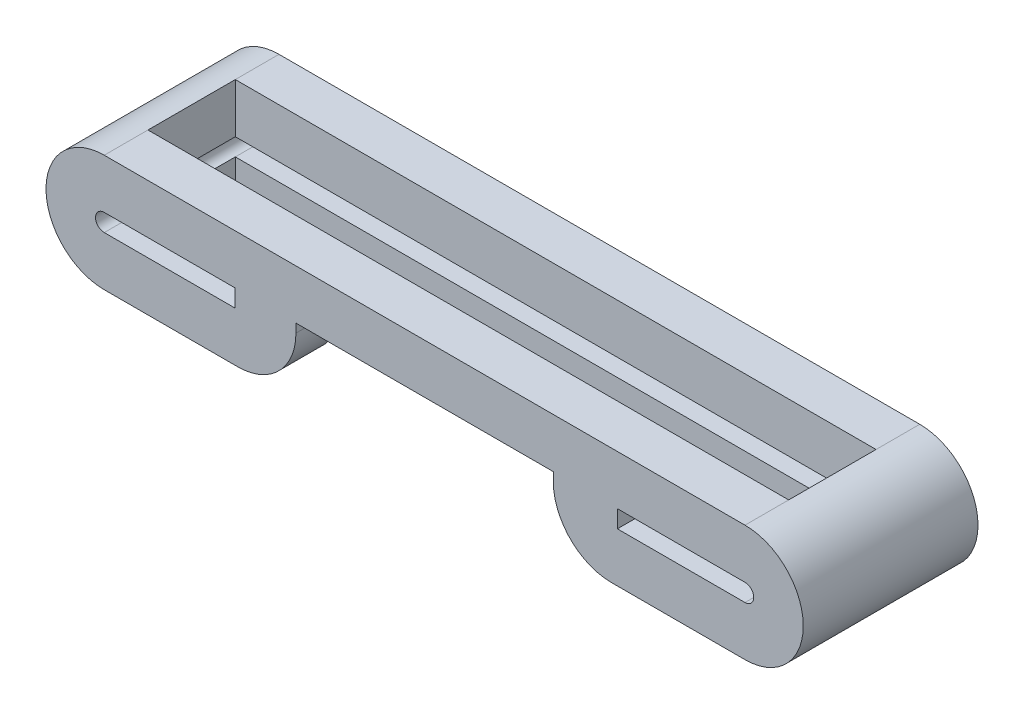
ISO-10303-21;
HEADER;
FILE_DESCRIPTION(('STEP AP214'),'2;1');
FILE_NAME('part.step','',(''),(''),'','','');
FILE_SCHEMA(('AUTOMOTIVE_DESIGN { 1 0 10303 214 1 1 1 1 }'));
ENDSEC;
DATA;
#1=APPLICATION_CONTEXT('core data for automotive mechanical design processes');
#2=APPLICATION_PROTOCOL_DEFINITION('international standard','automotive_design',2000,#1);
#3=PRODUCT_CONTEXT('',#1,'mechanical');
#4=PRODUCT('Part','Part','',(#3));
#5=PRODUCT_RELATED_PRODUCT_CATEGORY('part','',(#4));
#6=PRODUCT_DEFINITION_FORMATION('','',#4);
#7=PRODUCT_DEFINITION_CONTEXT('part definition',#1,'design');
#8=PRODUCT_DEFINITION('design','',#6,#7);
#9=PRODUCT_DEFINITION_SHAPE('','',#8);
#10=(LENGTH_UNIT() NAMED_UNIT(*) SI_UNIT(.MILLI.,.METRE.));
#11=(NAMED_UNIT(*) PLANE_ANGLE_UNIT() SI_UNIT($,.RADIAN.));
#12=(NAMED_UNIT(*) SI_UNIT($,.STERADIAN.) SOLID_ANGLE_UNIT());
#13=UNCERTAINTY_MEASURE_WITH_UNIT(LENGTH_MEASURE(1.E-05),#10,'distance_accuracy_value','');
#14=(GEOMETRIC_REPRESENTATION_CONTEXT(3) GLOBAL_UNCERTAINTY_ASSIGNED_CONTEXT((#13)) GLOBAL_UNIT_ASSIGNED_CONTEXT((#10,
#11,#12)) REPRESENTATION_CONTEXT('',''));
#15=CARTESIAN_POINT('',(0.,0.,0.));
#16=DIRECTION('',(0.,0.,1.));
#17=DIRECTION('',(1.,0.,0.));
#18=AXIS2_PLACEMENT_3D('',#15,#16,#17);
#19=CARTESIAN_POINT('',(-55.,1.5,30.));
#20=DIRECTION('',(0.,-1.,0.));
#21=DIRECTION('',(0.,0.,-1.));
#22=AXIS2_PLACEMENT_3D('',#19,#20,#21);
#23=PLANE('',#22);
#24=DIRECTION('',(-1.,0.,0.));
#25=VECTOR('',#24,1.);
#26=CARTESIAN_POINT('',(-55.,1.5,22.5));
#27=LINE('',#26,#25);
#28=CARTESIAN_POINT('',(22.095,1.5,22.5));
#29=VERTEX_POINT('',#28);
#30=CARTESIAN_POINT('',(-22.095,1.5,22.5));
#31=VERTEX_POINT('',#30);
#32=EDGE_CURVE('E222',#29,#31,#27,.T.);
#33=ORIENTED_EDGE('',*,*,#32,.F.);
#34=DIRECTION('',(0.,0.,1.));
#35=VECTOR('',#34,1.);
#36=CARTESIAN_POINT('',(22.095,1.5,29.9999999999999));
#37=LINE('',#36,#35);
#38=CARTESIAN_POINT('',(22.095,1.5,30.));
#39=VERTEX_POINT('',#38);
#40=EDGE_CURVE('E208',#29,#39,#37,.T.);
#41=ORIENTED_EDGE('',*,*,#40,.T.);
#42=DIRECTION('',(-1.,0.,0.));
#43=VECTOR('',#42,1.);
#44=CARTESIAN_POINT('',(-55.,1.5,30.));
#45=LINE('',#44,#43);
#46=CARTESIAN_POINT('',(-22.095,1.5,30.));
#47=VERTEX_POINT('',#46);
#48=EDGE_CURVE('E219',#39,#47,#45,.T.);
#49=ORIENTED_EDGE('',*,*,#48,.T.);
#50=DIRECTION('',(0.,0.,-1.));
#51=VECTOR('',#50,1.);
#52=CARTESIAN_POINT('',(-22.095,1.5,30.));
#53=LINE('',#52,#51);
#54=EDGE_CURVE('E223',#47,#31,#53,.T.);
#55=ORIENTED_EDGE('',*,*,#54,.T.);
#56=EDGE_LOOP('',(#33,#41,#49,#55));
#57=FACE_BOUND('',#56,.T.);
#58=ADVANCED_FACE('F33',(#57),#23,.T.);
#59=DIRECTION('',(0.,0.,1.));
#60=VECTOR('',#59,1.);
#61=CARTESIAN_POINT('',(33.095,1.5,22.5));
#62=LINE('',#61,#60);
#63=CARTESIAN_POINT('',(33.095,1.5,22.5));
#64=VERTEX_POINT('',#63);
#65=CARTESIAN_POINT('',(33.095,1.5,30.));
#66=VERTEX_POINT('',#65);
#67=EDGE_CURVE('E374',#64,#66,#62,.T.);
#68=ORIENTED_EDGE('',*,*,#67,.F.);
#69=CARTESIAN_POINT('',(55.,1.5,22.5));
#70=VERTEX_POINT('',#69);
#71=EDGE_CURVE('E309',#70,#64,#27,.T.);
#72=ORIENTED_EDGE('',*,*,#71,.F.);
#73=DIRECTION('',(0.,0.,-1.));
#74=VECTOR('',#73,1.);
#75=CARTESIAN_POINT('',(55.,1.5,30.));
#76=LINE('',#75,#74);
#77=CARTESIAN_POINT('',(55.,1.5,30.));
#78=VERTEX_POINT('',#77);
#79=EDGE_CURVE('E256',#78,#70,#76,.T.);
#80=ORIENTED_EDGE('',*,*,#79,.F.);
#81=EDGE_CURVE('E229',#78,#66,#45,.T.);
#82=ORIENTED_EDGE('',*,*,#81,.T.);
#83=EDGE_LOOP('',(#68,#72,#80,#82));
#84=FACE_BOUND('',#83,.T.);
#85=ADVANCED_FACE('F372',(#84),#23,.T.);
#86=CARTESIAN_POINT('',(-55.,-1.5,30.));
#87=DIRECTION('',(0.,1.,0.));
#88=DIRECTION('',(0.,0.,1.));
#89=AXIS2_PLACEMENT_3D('',#86,#87,#88);
#90=PLANE('',#89);
#91=DIRECTION('',(0.,0.,-1.));
#92=VECTOR('',#91,1.);
#93=CARTESIAN_POINT('',(33.095,-1.5,30.));
#94=LINE('',#93,#92);
#95=CARTESIAN_POINT('',(33.095,-1.5,30.));
#96=VERTEX_POINT('',#95);
#97=CARTESIAN_POINT('',(33.095,-1.5,22.5));
#98=VERTEX_POINT('',#97);
#99=EDGE_CURVE('E224',#96,#98,#94,.T.);
#100=ORIENTED_EDGE('',*,*,#99,.F.);
#101=DIRECTION('',(1.,0.,0.));
#102=VECTOR('',#101,1.);
#103=CARTESIAN_POINT('',(-55.,-1.5,30.));
#104=LINE('',#103,#102);
#105=CARTESIAN_POINT('',(55.,-1.5,30.));
#106=VERTEX_POINT('',#105);
#107=EDGE_CURVE('E347',#96,#106,#104,.T.);
#108=ORIENTED_EDGE('',*,*,#107,.T.);
#109=DIRECTION('',(0.,0.,-1.));
#110=VECTOR('',#109,1.);
#111=CARTESIAN_POINT('',(55.,-1.5,30.));
#112=LINE('',#111,#110);
#113=CARTESIAN_POINT('',(55.,-1.5,22.5));
#114=VERTEX_POINT('',#113);
#115=EDGE_CURVE('E261',#106,#114,#112,.T.);
#116=ORIENTED_EDGE('',*,*,#115,.T.);
#117=DIRECTION('',(1.,0.,0.));
#118=VECTOR('',#117,1.);
#119=CARTESIAN_POINT('',(-55.,-1.5,22.5));
#120=LINE('',#119,#118);
#121=EDGE_CURVE('E340',#98,#114,#120,.T.);
#122=ORIENTED_EDGE('',*,*,#121,.F.);
#123=EDGE_LOOP('',(#100,#108,#116,#122));
#124=FACE_BOUND('',#123,.T.);
#125=ADVANCED_FACE('F357',(#124),#90,.T.);
#126=DIRECTION('',(0.,0.,1.));
#127=VECTOR('',#126,1.);
#128=CARTESIAN_POINT('',(-32.595,-1.5,22.5));
#129=LINE('',#128,#127);
#130=CARTESIAN_POINT('',(-32.595,-1.5,22.5));
#131=VERTEX_POINT('',#130);
#132=CARTESIAN_POINT('',(-32.595,-1.5,30.));
#133=VERTEX_POINT('',#132);
#134=EDGE_CURVE('E382',#131,#133,#129,.T.);
#135=ORIENTED_EDGE('',*,*,#134,.F.);
#136=CARTESIAN_POINT('',(-55.,-1.5,22.5));
#137=VERTEX_POINT('',#136);
#138=EDGE_CURVE('E335',#137,#131,#120,.T.);
#139=ORIENTED_EDGE('',*,*,#138,.F.);
#140=DIRECTION('',(0.,0.,-1.));
#141=VECTOR('',#140,1.);
#142=CARTESIAN_POINT('',(-55.,-1.5,30.));
#143=LINE('',#142,#141);
#144=CARTESIAN_POINT('',(-55.,-1.5,30.));
#145=VERTEX_POINT('',#144);
#146=EDGE_CURVE('E265',#145,#137,#143,.T.);
#147=ORIENTED_EDGE('',*,*,#146,.F.);
#148=EDGE_CURVE('E348',#145,#133,#104,.T.);
#149=ORIENTED_EDGE('',*,*,#148,.T.);
#150=EDGE_LOOP('',(#135,#139,#147,#149));
#151=FACE_BOUND('',#150,.T.);
#152=ADVANCED_FACE('F468',(#151),#90,.T.);
#153=DIRECTION('',(0.,0.,-1.));
#154=VECTOR('',#153,1.);
#155=CARTESIAN_POINT('',(-32.595,1.5,30.));
#156=LINE('',#155,#154);
#157=CARTESIAN_POINT('',(-32.595,1.5,30.));
#158=VERTEX_POINT('',#157);
#159=CARTESIAN_POINT('',(-32.595,1.5,22.5));
#160=VERTEX_POINT('',#159);
#161=EDGE_CURVE('E479',#158,#160,#156,.T.);
#162=ORIENTED_EDGE('',*,*,#161,.F.);
#163=CARTESIAN_POINT('',(-55.,1.5,30.));
#164=VERTEX_POINT('',#163);
#165=EDGE_CURVE('E230',#158,#164,#45,.T.);
#166=ORIENTED_EDGE('',*,*,#165,.T.);
#167=DIRECTION('',(0.,0.,-1.));
#168=VECTOR('',#167,1.);
#169=CARTESIAN_POINT('',(-55.,1.5,30.));
#170=LINE('',#169,#168);
#171=CARTESIAN_POINT('',(-55.,1.5,22.5));
#172=VERTEX_POINT('',#171);
#173=EDGE_CURVE('E251',#164,#172,#170,.T.);
#174=ORIENTED_EDGE('',*,*,#173,.T.);
#175=EDGE_CURVE('E308',#160,#172,#27,.T.);
#176=ORIENTED_EDGE('',*,*,#175,.F.);
#177=EDGE_LOOP('',(#162,#166,#174,#176));
#178=FACE_BOUND('',#177,.T.);
#179=ADVANCED_FACE('F451',(#178),#23,.T.);
#180=CARTESIAN_POINT('',(-55.,-10.,30.));
#181=DIRECTION('',(0.,1.,0.));
#182=DIRECTION('',(0.,0.,1.));
#183=AXIS2_PLACEMENT_3D('',#180,#181,#182);
#184=PLANE('',#183);
#185=DIRECTION('',(1.,0.,0.));
#186=VECTOR('',#185,1.);
#187=CARTESIAN_POINT('',(-55.,-10.,30.));
#188=LINE('',#187,#186);
#189=CARTESIAN_POINT('',(32.095,-10.,30.));
#190=VERTEX_POINT('',#189);
#191=CARTESIAN_POINT('',(55.,-10.,30.));
#192=VERTEX_POINT('',#191);
#193=EDGE_CURVE('E272',#190,#192,#188,.T.);
#194=ORIENTED_EDGE('',*,*,#193,.F.);
#195=DIRECTION('',(0.,0.,-1.));
#196=VECTOR('',#195,1.);
#197=CARTESIAN_POINT('',(32.095,-10.,30.));
#198=LINE('',#197,#196);
#199=CARTESIAN_POINT('',(32.095,-10.,22.5));
#200=VERTEX_POINT('',#199);
#201=EDGE_CURVE('E41',#190,#200,#198,.T.);
#202=ORIENTED_EDGE('',*,*,#201,.T.);
#203=DIRECTION('',(1.,0.,0.));
#204=VECTOR('',#203,1.);
#205=CARTESIAN_POINT('',(-55.,-10.,22.5));
#206=LINE('',#205,#204);
#207=CARTESIAN_POINT('',(55.,-10.,22.5));
#208=VERTEX_POINT('',#207);
#209=EDGE_CURVE('E327',#200,#208,#206,.T.);
#210=ORIENTED_EDGE('',*,*,#209,.T.);
#211=DIRECTION('',(0.,0.,-1.));
#212=VECTOR('',#211,1.);
#213=CARTESIAN_POINT('',(55.,-10.,30.));
#214=LINE('',#213,#212);
#215=EDGE_CURVE('E299',#192,#208,#214,.T.);
#216=ORIENTED_EDGE('',*,*,#215,.F.);
#217=EDGE_LOOP('',(#194,#202,#210,#216));
#218=FACE_BOUND('',#217,.T.);
#219=ADVANCED_FACE('F325',(#218),#184,.F.);
#220=CARTESIAN_POINT('',(-55.,-10.,22.5));
#221=VERTEX_POINT('',#220);
#222=CARTESIAN_POINT('',(-32.095,-10.,22.5));
#223=VERTEX_POINT('',#222);
#224=EDGE_CURVE('E334',#221,#223,#206,.T.);
#225=ORIENTED_EDGE('',*,*,#224,.T.);
#226=DIRECTION('',(0.,0.,1.));
#227=VECTOR('',#226,1.);
#228=CARTESIAN_POINT('',(-32.095,-10.,30.));
#229=LINE('',#228,#227);
#230=CARTESIAN_POINT('',(-32.095,-10.,30.));
#231=VERTEX_POINT('',#230);
#232=EDGE_CURVE('E312',#223,#231,#229,.T.);
#233=ORIENTED_EDGE('',*,*,#232,.T.);
#234=CARTESIAN_POINT('',(-55.,-10.,30.));
#235=VERTEX_POINT('',#234);
#236=EDGE_CURVE('E274',#235,#231,#188,.T.);
#237=ORIENTED_EDGE('',*,*,#236,.F.);
#238=DIRECTION('',(0.,0.,-1.));
#239=VECTOR('',#238,1.);
#240=CARTESIAN_POINT('',(-55.,-10.,30.));
#241=LINE('',#240,#239);
#242=EDGE_CURVE('E303',#235,#221,#241,.T.);
#243=ORIENTED_EDGE('',*,*,#242,.T.);
#244=EDGE_LOOP('',(#225,#233,#237,#243));
#245=FACE_BOUND('',#244,.T.);
#246=ADVANCED_FACE('F474',(#245),#184,.F.);
#247=CARTESIAN_POINT('',(-55.,10.,30.));
#248=DIRECTION('',(0.,-1.,0.));
#249=DIRECTION('',(0.,0.,-1.));
#250=AXIS2_PLACEMENT_3D('',#247,#248,#249);
#251=PLANE('',#250);
#252=DIRECTION('',(0.,0.,-1.));
#253=VECTOR('',#252,1.);
#254=CARTESIAN_POINT('',(55.,10.,30.));
#255=LINE('',#254,#253);
#256=CARTESIAN_POINT('',(55.,10.,30.));
#257=VERTEX_POINT('',#256);
#258=CARTESIAN_POINT('',(55.,10.,22.5));
#259=VERTEX_POINT('',#258);
#260=EDGE_CURVE('E295',#257,#259,#255,.T.);
#261=ORIENTED_EDGE('',*,*,#260,.T.);
#262=DIRECTION('',(1.,0.,0.));
#263=VECTOR('',#262,1.);
#264=CARTESIAN_POINT('',(-55.,9.99999999999999,22.5));
#265=LINE('',#264,#263);
#266=CARTESIAN_POINT('',(-55.,9.99999999999999,22.5));
#267=VERTEX_POINT('',#266);
#268=EDGE_CURVE('E400',#267,#259,#265,.T.);
#269=ORIENTED_EDGE('',*,*,#268,.F.);
#270=DIRECTION('',(0.,0.,-1.));
#271=VECTOR('',#270,1.);
#272=CARTESIAN_POINT('',(-55.,10.,30.));
#273=LINE('',#272,#271);
#274=CARTESIAN_POINT('',(-55.,10.,30.));
#275=VERTEX_POINT('',#274);
#276=EDGE_CURVE('E291',#275,#267,#273,.T.);
#277=ORIENTED_EDGE('',*,*,#276,.F.);
#278=DIRECTION('',(-1.,0.,0.));
#279=VECTOR('',#278,1.);
#280=CARTESIAN_POINT('',(-55.,10.,30.));
#281=LINE('',#280,#279);
#282=EDGE_CURVE('E278',#257,#275,#281,.T.);
#283=ORIENTED_EDGE('',*,*,#282,.F.);
#284=EDGE_LOOP('',(#261,#269,#277,#283));
#285=FACE_BOUND('',#284,.T.);
#286=ADVANCED_FACE('F520',(#285),#251,.F.);
#287=CARTESIAN_POINT('',(-55.,0.,30.));
#288=DIRECTION('',(0.,0.,1.));
#289=DIRECTION('',(1.,0.,0.));
#290=AXIS2_PLACEMENT_3D('',#287,#288,#289);
#291=PLANE('',#290);
#292=ORIENTED_EDGE('',*,*,#165,.F.);
#293=DIRECTION('',(0.,1.,0.));
#294=VECTOR('',#293,1.);
#295=CARTESIAN_POINT('',(-32.595,-1.5,30.));
#296=LINE('',#295,#294);
#297=EDGE_CURVE('E487',#133,#158,#296,.T.);
#298=ORIENTED_EDGE('',*,*,#297,.F.);
#299=ORIENTED_EDGE('',*,*,#148,.F.);
#300=CARTESIAN_POINT('',(-55.,0.,30.));
#301=DIRECTION('',(0.,0.,1.));
#302=DIRECTION('',(1.,0.,0.));
#303=AXIS2_PLACEMENT_3D('',#300,#301,#302);
#304=CIRCLE('',#303,1.5);
#305=EDGE_CURVE('E250',#164,#145,#304,.T.);
#306=ORIENTED_EDGE('',*,*,#305,.F.);
#307=EDGE_LOOP('',(#292,#298,#299,#306));
#308=FACE_BOUND('',#307,.T.);
#309=ORIENTED_EDGE('',*,*,#107,.F.);
#310=DIRECTION('',(0.,-1.,0.));
#311=VECTOR('',#310,1.);
#312=CARTESIAN_POINT('',(33.095,1.5,30.));
#313=LINE('',#312,#311);
#314=EDGE_CURVE('E369',#66,#96,#313,.T.);
#315=ORIENTED_EDGE('',*,*,#314,.F.);
#316=ORIENTED_EDGE('',*,*,#81,.F.);
#317=CARTESIAN_POINT('',(55.,0.,30.));
#318=DIRECTION('',(0.,0.,1.));
#319=DIRECTION('',(1.,0.,0.));
#320=AXIS2_PLACEMENT_3D('',#317,#318,#319);
#321=CIRCLE('',#320,1.5);
#322=EDGE_CURVE('E233',#106,#78,#321,.T.);
#323=ORIENTED_EDGE('',*,*,#322,.F.);
#324=EDGE_LOOP('',(#309,#315,#316,#323));
#325=FACE_BOUND('',#324,.T.);
#326=ORIENTED_EDGE('',*,*,#236,.T.);
#327=CARTESIAN_POINT('',(-32.095,0.,30.));
#328=DIRECTION('',(0.,0.,1.));
#329=DIRECTION('',(1.,0.,0.));
#330=AXIS2_PLACEMENT_3D('',#327,#328,#329);
#331=CIRCLE('',#330,10.);
#332=CARTESIAN_POINT('',(-22.095,0.,30.));
#333=VERTEX_POINT('',#332);
#334=EDGE_CURVE('E317',#231,#333,#331,.T.);
#335=ORIENTED_EDGE('',*,*,#334,.T.);
#336=DIRECTION('',(0.,1.,0.));
#337=VECTOR('',#336,1.);
#338=CARTESIAN_POINT('',(-22.095,-10.,30.));
#339=LINE('',#338,#337);
#340=EDGE_CURVE('E214',#333,#47,#339,.T.);
#341=ORIENTED_EDGE('',*,*,#340,.T.);
#342=ORIENTED_EDGE('',*,*,#48,.F.);
#343=DIRECTION('',(0.,1.,0.));
#344=VECTOR('',#343,1.);
#345=CARTESIAN_POINT('',(22.095,-10.,30.));
#346=LINE('',#345,#344);
#347=CARTESIAN_POINT('',(22.095,0.,30.));
#348=VERTEX_POINT('',#347);
#349=EDGE_CURVE('E205',#348,#39,#346,.T.);
#350=ORIENTED_EDGE('',*,*,#349,.F.);
#351=CARTESIAN_POINT('',(32.095,0.,30.));
#352=DIRECTION('',(0.,0.,1.));
#353=DIRECTION('',(1.,0.,0.));
#354=AXIS2_PLACEMENT_3D('',#351,#352,#353);
#355=CIRCLE('',#354,10.);
#356=EDGE_CURVE('E315',#348,#190,#355,.T.);
#357=ORIENTED_EDGE('',*,*,#356,.T.);
#358=ORIENTED_EDGE('',*,*,#193,.T.);
#359=CARTESIAN_POINT('',(55.,0.,30.));
#360=DIRECTION('',(0.,0.,1.));
#361=DIRECTION('',(1.,0.,0.));
#362=AXIS2_PLACEMENT_3D('',#359,#360,#361);
#363=CIRCLE('',#362,10.);
#364=EDGE_CURVE('E276',#192,#257,#363,.T.);
#365=ORIENTED_EDGE('',*,*,#364,.T.);
#366=ORIENTED_EDGE('',*,*,#282,.T.);
#367=CARTESIAN_POINT('',(-55.,0.,30.));
#368=DIRECTION('',(0.,0.,1.));
#369=DIRECTION('',(1.,0.,0.));
#370=AXIS2_PLACEMENT_3D('',#367,#368,#369);
#371=CIRCLE('',#370,10.);
#372=EDGE_CURVE('E269',#275,#235,#371,.T.);
#373=ORIENTED_EDGE('',*,*,#372,.T.);
#374=EDGE_LOOP('',(#326,#335,#341,#342,#350,#357,#358,#365,#366,#373));
#375=FACE_BOUND('',#374,.T.);
#376=ADVANCED_FACE('F227',(#308,#325,#375),#291,.T.);
#377=CARTESIAN_POINT('',(-55.,0.,0.));
#378=DIRECTION('',(0.,0.,1.));
#379=DIRECTION('',(1.,0.,0.));
#380=AXIS2_PLACEMENT_3D('',#377,#378,#379);
#381=PLANE('',#380);
#382=CARTESIAN_POINT('',(-55.,0.,0.));
#383=DIRECTION('',(0.,0.,1.));
#384=DIRECTION('',(1.,0.,0.));
#385=AXIS2_PLACEMENT_3D('',#382,#383,#384);
#386=CIRCLE('',#385,10.);
#387=CARTESIAN_POINT('',(-55.,10.,0.));
#388=VERTEX_POINT('',#387);
#389=CARTESIAN_POINT('',(-55.,-10.,0.));
#390=VERTEX_POINT('',#389);
#391=EDGE_CURVE('E268',#388,#390,#386,.T.);
#392=ORIENTED_EDGE('',*,*,#391,.F.);
#393=DIRECTION('',(-1.,0.,0.));
#394=VECTOR('',#393,1.);
#395=CARTESIAN_POINT('',(-55.,10.,0.));
#396=LINE('',#395,#394);
#397=CARTESIAN_POINT('',(55.,10.,0.));
#398=VERTEX_POINT('',#397);
#399=EDGE_CURVE('E273',#398,#388,#396,.T.);
#400=ORIENTED_EDGE('',*,*,#399,.F.);
#401=CARTESIAN_POINT('',(55.,0.,0.));
#402=DIRECTION('',(0.,0.,1.));
#403=DIRECTION('',(1.,0.,0.));
#404=AXIS2_PLACEMENT_3D('',#401,#402,#403);
#405=CIRCLE('',#404,10.);
#406=CARTESIAN_POINT('',(55.,-10.,0.));
#407=VERTEX_POINT('',#406);
#408=EDGE_CURVE('E286',#407,#398,#405,.T.);
#409=ORIENTED_EDGE('',*,*,#408,.F.);
#410=DIRECTION('',(1.,0.,0.));
#411=VECTOR('',#410,1.);
#412=CARTESIAN_POINT('',(-55.,-10.,0.));
#413=LINE('',#412,#411);
#414=EDGE_CURVE('E283',#390,#407,#413,.T.);
#415=ORIENTED_EDGE('',*,*,#414,.F.);
#416=EDGE_LOOP('',(#392,#400,#409,#415));
#417=FACE_BOUND('',#416,.T.);
#418=CARTESIAN_POINT('',(-55.,0.,0.));
#419=DIRECTION('',(0.,0.,1.));
#420=DIRECTION('',(1.,0.,0.));
#421=AXIS2_PLACEMENT_3D('',#418,#419,#420);
#422=CIRCLE('',#421,1.5);
#423=CARTESIAN_POINT('',(-55.,1.5,0.));
#424=VERTEX_POINT('',#423);
#425=CARTESIAN_POINT('',(-55.,-1.5,0.));
#426=VERTEX_POINT('',#425);
#427=EDGE_CURVE('E237',#424,#426,#422,.T.);
#428=ORIENTED_EDGE('',*,*,#427,.T.);
#429=DIRECTION('',(1.,0.,0.));
#430=VECTOR('',#429,1.);
#431=CARTESIAN_POINT('',(-55.,-1.5,0.));
#432=LINE('',#431,#430);
#433=CARTESIAN_POINT('',(55.,-1.5,0.));
#434=VERTEX_POINT('',#433);
#435=EDGE_CURVE('E240',#426,#434,#432,.T.);
#436=ORIENTED_EDGE('',*,*,#435,.T.);
#437=CARTESIAN_POINT('',(55.,0.,0.));
#438=DIRECTION('',(0.,0.,1.));
#439=DIRECTION('',(1.,0.,0.));
#440=AXIS2_PLACEMENT_3D('',#437,#438,#439);
#441=CIRCLE('',#440,1.5);
#442=CARTESIAN_POINT('',(55.,1.5,0.));
#443=VERTEX_POINT('',#442);
#444=EDGE_CURVE('E244',#434,#443,#441,.T.);
#445=ORIENTED_EDGE('',*,*,#444,.T.);
#446=DIRECTION('',(-1.,0.,0.));
#447=VECTOR('',#446,1.);
#448=CARTESIAN_POINT('',(-55.,1.5,0.));
#449=LINE('',#448,#447);
#450=EDGE_CURVE('E247',#443,#424,#449,.T.);
#451=ORIENTED_EDGE('',*,*,#450,.T.);
#452=EDGE_LOOP('',(#428,#436,#445,#451));
#453=FACE_BOUND('',#452,.T.);
#454=ADVANCED_FACE('F511',(#417,#453),#381,.F.);
#455=CARTESIAN_POINT('',(-55.,0.,30.));
#456=DIRECTION('',(0.,0.,-1.));
#457=DIRECTION('',(-1.,0.,0.));
#458=AXIS2_PLACEMENT_3D('',#455,#456,#457);
#459=CYLINDRICAL_SURFACE('',#458,10.);
#460=ORIENTED_EDGE('',*,*,#391,.T.);
#461=CARTESIAN_POINT('',(-55.,-10.,7.49999999999999));
#462=VERTEX_POINT('',#461);
#463=EDGE_CURVE('E302',#462,#390,#241,.T.);
#464=ORIENTED_EDGE('',*,*,#463,.F.);
#465=DIRECTION('',(0.,0.,1.));
#466=VECTOR('',#465,1.);
#467=CARTESIAN_POINT('',(-55.,-10.,30.));
#468=LINE('',#467,#466);
#469=EDGE_CURVE('E421',#462,#221,#468,.T.);
#470=ORIENTED_EDGE('',*,*,#469,.T.);
#471=ORIENTED_EDGE('',*,*,#242,.F.);
#472=ORIENTED_EDGE('',*,*,#372,.F.);
#473=ORIENTED_EDGE('',*,*,#276,.T.);
#474=DIRECTION('',(0.,0.,1.));
#475=VECTOR('',#474,1.);
#476=CARTESIAN_POINT('',(-55.,9.99999999999999,7.49999999999999));
#477=LINE('',#476,#475);
#478=CARTESIAN_POINT('',(-55.,9.99999999999999,7.49999999999999));
#479=VERTEX_POINT('',#478);
#480=EDGE_CURVE('E397',#479,#267,#477,.T.);
#481=ORIENTED_EDGE('',*,*,#480,.F.);
#482=EDGE_CURVE('E280',#479,#388,#273,.T.);
#483=ORIENTED_EDGE('',*,*,#482,.T.);
#484=EDGE_LOOP('',(#460,#464,#470,#471,#472,#473,#481,#483));
#485=FACE_BOUND('',#484,.T.);
#486=ADVANCED_FACE('F523',(#485),#459,.T.);
#487=CARTESIAN_POINT('',(55.,-10.,7.49999999999999));
#488=VERTEX_POINT('',#487);
#489=EDGE_CURVE('E298',#488,#407,#214,.T.);
#490=ORIENTED_EDGE('',*,*,#489,.F.);
#491=DIRECTION('',(-1.,0.,0.));
#492=VECTOR('',#491,1.);
#493=CARTESIAN_POINT('',(-55.,-10.,7.49999999999999));
#494=LINE('',#493,#492);
#495=EDGE_CURVE('E417',#488,#462,#494,.T.);
#496=ORIENTED_EDGE('',*,*,#495,.T.);
#497=ORIENTED_EDGE('',*,*,#463,.T.);
#498=ORIENTED_EDGE('',*,*,#414,.T.);
#499=EDGE_LOOP('',(#490,#496,#497,#498));
#500=FACE_BOUND('',#499,.T.);
#501=ADVANCED_FACE('F476',(#500),#184,.F.);
#502=CARTESIAN_POINT('',(55.,0.,30.));
#503=DIRECTION('',(0.,0.,-1.));
#504=DIRECTION('',(-1.,0.,0.));
#505=AXIS2_PLACEMENT_3D('',#502,#503,#504);
#506=CYLINDRICAL_SURFACE('',#505,10.);
#507=ORIENTED_EDGE('',*,*,#408,.T.);
#508=CARTESIAN_POINT('',(55.,10.,7.49999999999999));
#509=VERTEX_POINT('',#508);
#510=EDGE_CURVE('E294',#509,#398,#255,.T.);
#511=ORIENTED_EDGE('',*,*,#510,.F.);
#512=DIRECTION('',(0.,0.,-1.));
#513=VECTOR('',#512,1.);
#514=CARTESIAN_POINT('',(55.,10.,7.49999999999999));
#515=LINE('',#514,#513);
#516=EDGE_CURVE('E213',#259,#509,#515,.T.);
#517=ORIENTED_EDGE('',*,*,#516,.F.);
#518=ORIENTED_EDGE('',*,*,#260,.F.);
#519=ORIENTED_EDGE('',*,*,#364,.F.);
#520=ORIENTED_EDGE('',*,*,#215,.T.);
#521=DIRECTION('',(0.,0.,-1.));
#522=VECTOR('',#521,1.);
#523=CARTESIAN_POINT('',(55.,-10.,30.));
#524=LINE('',#523,#522);
#525=EDGE_CURVE('E241',#208,#488,#524,.T.);
#526=ORIENTED_EDGE('',*,*,#525,.T.);
#527=ORIENTED_EDGE('',*,*,#489,.T.);
#528=EDGE_LOOP('',(#507,#511,#517,#518,#519,#520,#526,#527));
#529=FACE_BOUND('',#528,.T.);
#530=ADVANCED_FACE('F431',(#529),#506,.T.);
#531=ORIENTED_EDGE('',*,*,#482,.F.);
#532=DIRECTION('',(-1.,0.,0.));
#533=VECTOR('',#532,1.);
#534=CARTESIAN_POINT('',(-55.,9.99999999999999,7.49999999999999));
#535=LINE('',#534,#533);
#536=EDGE_CURVE('E394',#509,#479,#535,.T.);
#537=ORIENTED_EDGE('',*,*,#536,.F.);
#538=ORIENTED_EDGE('',*,*,#510,.T.);
#539=ORIENTED_EDGE('',*,*,#399,.T.);
#540=EDGE_LOOP('',(#531,#537,#538,#539));
#541=FACE_BOUND('',#540,.T.);
#542=ADVANCED_FACE('F545',(#541),#251,.F.);
#543=CARTESIAN_POINT('',(-55.,0.,30.));
#544=DIRECTION('',(0.,0.,-1.));
#545=DIRECTION('',(-1.,0.,0.));
#546=AXIS2_PLACEMENT_3D('',#543,#544,#545);
#547=CYLINDRICAL_SURFACE('',#546,1.5);
#548=ORIENTED_EDGE('',*,*,#427,.F.);
#549=CARTESIAN_POINT('',(-55.,1.5,7.49999999999999));
#550=VERTEX_POINT('',#549);
#551=EDGE_CURVE('E232',#550,#424,#170,.T.);
#552=ORIENTED_EDGE('',*,*,#551,.F.);
#553=EDGE_CURVE('E255',#172,#550,#170,.T.);
#554=ORIENTED_EDGE('',*,*,#553,.F.);
#555=ORIENTED_EDGE('',*,*,#173,.F.);
#556=ORIENTED_EDGE('',*,*,#305,.T.);
#557=ORIENTED_EDGE('',*,*,#146,.T.);
#558=DIRECTION('',(0.,0.,1.));
#559=VECTOR('',#558,1.);
#560=CARTESIAN_POINT('',(-55.,-1.5,30.));
#561=LINE('',#560,#559);
#562=CARTESIAN_POINT('',(-55.,-1.5,7.49999999999999));
#563=VERTEX_POINT('',#562);
#564=EDGE_CURVE('E420',#563,#137,#561,.T.);
#565=ORIENTED_EDGE('',*,*,#564,.F.);
#566=EDGE_CURVE('E264',#563,#426,#143,.T.);
#567=ORIENTED_EDGE('',*,*,#566,.T.);
#568=EDGE_LOOP('',(#548,#552,#554,#555,#556,#557,#565,#567));
#569=FACE_BOUND('',#568,.T.);
#570=ADVANCED_FACE('F501',(#569),#547,.F.);
#571=DIRECTION('',(-1.,0.,0.));
#572=VECTOR('',#571,1.);
#573=CARTESIAN_POINT('',(-55.,-1.5,7.49999999999999));
#574=LINE('',#573,#572);
#575=CARTESIAN_POINT('',(55.,-1.5,7.49999999999999));
#576=VERTEX_POINT('',#575);
#577=EDGE_CURVE('E415',#576,#563,#574,.T.);
#578=ORIENTED_EDGE('',*,*,#577,.F.);
#579=EDGE_CURVE('E259',#576,#434,#112,.T.);
#580=ORIENTED_EDGE('',*,*,#579,.T.);
#581=ORIENTED_EDGE('',*,*,#435,.F.);
#582=ORIENTED_EDGE('',*,*,#566,.F.);
#583=EDGE_LOOP('',(#578,#580,#581,#582));
#584=FACE_BOUND('',#583,.T.);
#585=ADVANCED_FACE('F465',(#584),#90,.T.);
#586=CARTESIAN_POINT('',(55.,0.,30.));
#587=DIRECTION('',(0.,0.,-1.));
#588=DIRECTION('',(-1.,0.,0.));
#589=AXIS2_PLACEMENT_3D('',#586,#587,#588);
#590=CYLINDRICAL_SURFACE('',#589,1.5);
#591=ORIENTED_EDGE('',*,*,#444,.F.);
#592=ORIENTED_EDGE('',*,*,#579,.F.);
#593=DIRECTION('',(0.,0.,-1.));
#594=VECTOR('',#593,1.);
#595=CARTESIAN_POINT('',(55.,-1.5,30.));
#596=LINE('',#595,#594);
#597=EDGE_CURVE('E338',#114,#576,#596,.T.);
#598=ORIENTED_EDGE('',*,*,#597,.F.);
#599=ORIENTED_EDGE('',*,*,#115,.F.);
#600=ORIENTED_EDGE('',*,*,#322,.T.);
#601=ORIENTED_EDGE('',*,*,#79,.T.);
#602=CARTESIAN_POINT('',(55.,1.5,7.49999999999999));
#603=VERTEX_POINT('',#602);
#604=EDGE_CURVE('E260',#70,#603,#76,.T.);
#605=ORIENTED_EDGE('',*,*,#604,.T.);
#606=EDGE_CURVE('E254',#603,#443,#76,.T.);
#607=ORIENTED_EDGE('',*,*,#606,.T.);
#608=EDGE_LOOP('',(#591,#592,#598,#599,#600,#601,#605,#607));
#609=FACE_BOUND('',#608,.T.);
#610=ADVANCED_FACE('F366',(#609),#590,.F.);
#611=DIRECTION('',(1.,0.,0.));
#612=VECTOR('',#611,1.);
#613=CARTESIAN_POINT('',(-55.,1.5,7.49999999999999));
#614=LINE('',#613,#612);
#615=EDGE_CURVE('E306',#550,#603,#614,.T.);
#616=ORIENTED_EDGE('',*,*,#615,.F.);
#617=ORIENTED_EDGE('',*,*,#551,.T.);
#618=ORIENTED_EDGE('',*,*,#450,.F.);
#619=ORIENTED_EDGE('',*,*,#606,.F.);
#620=EDGE_LOOP('',(#616,#617,#618,#619));
#621=FACE_BOUND('',#620,.T.);
#622=ADVANCED_FACE('F447',(#621),#23,.T.);
#623=CARTESIAN_POINT('',(-55.,-20.,7.49999999999999));
#624=DIRECTION('',(0.,0.,-1.));
#625=DIRECTION('',(-1.,0.,0.));
#626=AXIS2_PLACEMENT_3D('',#623,#624,#625);
#627=PLANE('',#626);
#628=ORIENTED_EDGE('',*,*,#615,.T.);
#629=DIRECTION('',(0.,1.,0.));
#630=VECTOR('',#629,1.);
#631=CARTESIAN_POINT('',(55.,-20.,7.49999999999999));
#632=LINE('',#631,#630);
#633=EDGE_CURVE('E403',#603,#509,#632,.T.);
#634=ORIENTED_EDGE('',*,*,#633,.T.);
#635=ORIENTED_EDGE('',*,*,#536,.T.);
#636=DIRECTION('',(0.,1.,0.));
#637=VECTOR('',#636,1.);
#638=CARTESIAN_POINT('',(-55.,-20.,7.49999999999999));
#639=LINE('',#638,#637);
#640=EDGE_CURVE('E410',#550,#479,#639,.T.);
#641=ORIENTED_EDGE('',*,*,#640,.F.);
#642=EDGE_LOOP('',(#628,#634,#635,#641));
#643=FACE_BOUND('',#642,.T.);
#644=ADVANCED_FACE('F455',(#643),#627,.F.);
#645=CARTESIAN_POINT('',(-55.,-20.,7.49999999999999));
#646=DIRECTION('',(-1.,0.,0.));
#647=DIRECTION('',(0.,-1.,0.));
#648=AXIS2_PLACEMENT_3D('',#645,#646,#647);
#649=PLANE('',#648);
#650=ORIENTED_EDGE('',*,*,#553,.T.);
#651=ORIENTED_EDGE('',*,*,#640,.T.);
#652=ORIENTED_EDGE('',*,*,#480,.T.);
#653=DIRECTION('',(0.,1.,0.));
#654=VECTOR('',#653,1.);
#655=CARTESIAN_POINT('',(-55.,-20.,22.5));
#656=LINE('',#655,#654);
#657=EDGE_CURVE('E407',#172,#267,#656,.T.);
#658=ORIENTED_EDGE('',*,*,#657,.F.);
#659=EDGE_LOOP('',(#650,#651,#652,#658));
#660=FACE_BOUND('',#659,.T.);
#661=ADVANCED_FACE('F461',(#660),#649,.F.);
#662=CARTESIAN_POINT('',(55.,-20.,7.49999999999999));
#663=DIRECTION('',(1.,0.,0.));
#664=DIRECTION('',(0.,1.,0.));
#665=AXIS2_PLACEMENT_3D('',#662,#663,#664);
#666=PLANE('',#665);
#667=ORIENTED_EDGE('',*,*,#604,.F.);
#668=DIRECTION('',(0.,1.,0.));
#669=VECTOR('',#668,1.);
#670=CARTESIAN_POINT('',(55.,-20.,22.5));
#671=LINE('',#670,#669);
#672=EDGE_CURVE('E404',#70,#259,#671,.T.);
#673=ORIENTED_EDGE('',*,*,#672,.T.);
#674=ORIENTED_EDGE('',*,*,#516,.T.);
#675=ORIENTED_EDGE('',*,*,#633,.F.);
#676=EDGE_LOOP('',(#667,#673,#674,#675));
#677=FACE_BOUND('',#676,.T.);
#678=ADVANCED_FACE('F516',(#677),#666,.F.);
#679=EDGE_CURVE('E333',#208,#114,#671,.T.);
#680=ORIENTED_EDGE('',*,*,#679,.T.);
#681=ORIENTED_EDGE('',*,*,#597,.T.);
#682=EDGE_CURVE('E412',#488,#576,#632,.T.);
#683=ORIENTED_EDGE('',*,*,#682,.F.);
#684=ORIENTED_EDGE('',*,*,#525,.F.);
#685=EDGE_LOOP('',(#680,#681,#683,#684));
#686=FACE_BOUND('',#685,.T.);
#687=ADVANCED_FACE('F427',(#686),#666,.F.);
#688=CARTESIAN_POINT('',(-55.,-20.,22.5));
#689=DIRECTION('',(0.,0.,1.));
#690=DIRECTION('',(1.,0.,0.));
#691=AXIS2_PLACEMENT_3D('',#688,#689,#690);
#692=PLANE('',#691);
#693=DIRECTION('',(0.,1.,0.));
#694=VECTOR('',#693,1.);
#695=CARTESIAN_POINT('',(-22.095,-10.,22.5));
#696=LINE('',#695,#694);
#697=CARTESIAN_POINT('',(-22.095,0.,22.5));
#698=VERTEX_POINT('',#697);
#699=EDGE_CURVE('E390',#698,#31,#696,.T.);
#700=ORIENTED_EDGE('',*,*,#699,.F.);
#701=CARTESIAN_POINT('',(-32.095,0.,22.5));
#702=DIRECTION('',(0.,0.,1.));
#703=DIRECTION('',(1.,0.,0.));
#704=AXIS2_PLACEMENT_3D('',#701,#702,#703);
#705=CIRCLE('',#704,10.);
#706=EDGE_CURVE('E322',#698,#223,#705,.F.);
#707=ORIENTED_EDGE('',*,*,#706,.T.);
#708=ORIENTED_EDGE('',*,*,#224,.F.);
#709=EDGE_CURVE('E406',#221,#137,#656,.T.);
#710=ORIENTED_EDGE('',*,*,#709,.T.);
#711=ORIENTED_EDGE('',*,*,#138,.T.);
#712=DIRECTION('',(0.,-1.,0.));
#713=VECTOR('',#712,1.);
#714=CARTESIAN_POINT('',(-32.595,1.5,22.5));
#715=LINE('',#714,#713);
#716=EDGE_CURVE('E486',#160,#131,#715,.T.);
#717=ORIENTED_EDGE('',*,*,#716,.F.);
#718=ORIENTED_EDGE('',*,*,#175,.T.);
#719=ORIENTED_EDGE('',*,*,#657,.T.);
#720=ORIENTED_EDGE('',*,*,#268,.T.);
#721=ORIENTED_EDGE('',*,*,#672,.F.);
#722=ORIENTED_EDGE('',*,*,#71,.T.);
#723=DIRECTION('',(0.,1.,0.));
#724=VECTOR('',#723,1.);
#725=CARTESIAN_POINT('',(33.095,-1.5,22.5));
#726=LINE('',#725,#724);
#727=EDGE_CURVE('E379',#98,#64,#726,.T.);
#728=ORIENTED_EDGE('',*,*,#727,.F.);
#729=ORIENTED_EDGE('',*,*,#121,.T.);
#730=ORIENTED_EDGE('',*,*,#679,.F.);
#731=ORIENTED_EDGE('',*,*,#209,.F.);
#732=CARTESIAN_POINT('',(32.095,0.,22.5));
#733=DIRECTION('',(0.,0.,1.));
#734=DIRECTION('',(1.,0.,0.));
#735=AXIS2_PLACEMENT_3D('',#732,#733,#734);
#736=CIRCLE('',#735,10.);
#737=CARTESIAN_POINT('',(22.095,0.,22.5));
#738=VERTEX_POINT('',#737);
#739=EDGE_CURVE('E48',#200,#738,#736,.F.);
#740=ORIENTED_EDGE('',*,*,#739,.T.);
#741=DIRECTION('',(0.,1.,0.));
#742=VECTOR('',#741,1.);
#743=CARTESIAN_POINT('',(22.095,-10.,22.5));
#744=LINE('',#743,#742);
#745=EDGE_CURVE('E387',#738,#29,#744,.T.);
#746=ORIENTED_EDGE('',*,*,#745,.T.);
#747=ORIENTED_EDGE('',*,*,#32,.T.);
#748=EDGE_LOOP('',(#700,#707,#708,#710,#711,#717,#718,#719,#720,#721,#722,#728,#729,#730,#731,
#740,#746,#747));
#749=FACE_BOUND('',#748,.T.);
#750=ADVANCED_FACE('F331',(#749),#692,.F.);
#751=EDGE_CURVE('E409',#462,#563,#639,.T.);
#752=ORIENTED_EDGE('',*,*,#751,.T.);
#753=ORIENTED_EDGE('',*,*,#564,.T.);
#754=ORIENTED_EDGE('',*,*,#709,.F.);
#755=ORIENTED_EDGE('',*,*,#469,.F.);
#756=EDGE_LOOP('',(#752,#753,#754,#755));
#757=FACE_BOUND('',#756,.T.);
#758=ADVANCED_FACE('F532',(#757),#649,.F.);
#759=ORIENTED_EDGE('',*,*,#682,.T.);
#760=ORIENTED_EDGE('',*,*,#577,.T.);
#761=ORIENTED_EDGE('',*,*,#751,.F.);
#762=ORIENTED_EDGE('',*,*,#495,.F.);
#763=EDGE_LOOP('',(#759,#760,#761,#762));
#764=FACE_BOUND('',#763,.T.);
#765=ADVANCED_FACE('F464',(#764),#627,.F.);
#766=CARTESIAN_POINT('',(-22.095,-10.,30.));
#767=DIRECTION('',(-1.,0.,0.));
#768=DIRECTION('',(0.,0.,1.));
#769=AXIS2_PLACEMENT_3D('',#766,#767,#768);
#770=PLANE('',#769);
#771=ORIENTED_EDGE('',*,*,#340,.F.);
#772=DIRECTION('',(0.,0.,1.));
#773=VECTOR('',#772,1.);
#774=CARTESIAN_POINT('',(-22.095,0.,30.));
#775=LINE('',#774,#773);
#776=EDGE_CURVE('E319',#333,#698,#775,.F.);
#777=ORIENTED_EDGE('',*,*,#776,.T.);
#778=ORIENTED_EDGE('',*,*,#699,.T.);
#779=ORIENTED_EDGE('',*,*,#54,.F.);
#780=EDGE_LOOP('',(#771,#777,#778,#779));
#781=FACE_BOUND('',#780,.T.);
#782=ADVANCED_FACE('F529',(#781),#770,.F.);
#783=CARTESIAN_POINT('',(22.095,-10.,30.));
#784=DIRECTION('',(1.,0.,0.));
#785=DIRECTION('',(0.,0.,-1.));
#786=AXIS2_PLACEMENT_3D('',#783,#784,#785);
#787=PLANE('',#786);
#788=ORIENTED_EDGE('',*,*,#745,.F.);
#789=DIRECTION('',(0.,0.,-1.));
#790=VECTOR('',#789,1.);
#791=CARTESIAN_POINT('',(22.095,0.,30.));
#792=LINE('',#791,#790);
#793=EDGE_CURVE('E11',#738,#348,#792,.F.);
#794=ORIENTED_EDGE('',*,*,#793,.T.);
#795=ORIENTED_EDGE('',*,*,#349,.T.);
#796=ORIENTED_EDGE('',*,*,#40,.F.);
#797=EDGE_LOOP('',(#788,#794,#795,#796));
#798=FACE_BOUND('',#797,.T.);
#799=ADVANCED_FACE('F207',(#798),#787,.F.);
#800=CARTESIAN_POINT('',(33.095,0.,0.));
#801=DIRECTION('',(1.,0.,0.));
#802=DIRECTION('',(0.,0.,-1.));
#803=AXIS2_PLACEMENT_3D('',#800,#801,#802);
#804=PLANE('',#803);
#805=ORIENTED_EDGE('',*,*,#727,.T.);
#806=ORIENTED_EDGE('',*,*,#67,.T.);
#807=ORIENTED_EDGE('',*,*,#314,.T.);
#808=ORIENTED_EDGE('',*,*,#99,.T.);
#809=EDGE_LOOP('',(#805,#806,#807,#808));
#810=FACE_BOUND('',#809,.T.);
#811=ADVANCED_FACE('F377',(#810),#804,.T.);
#812=CARTESIAN_POINT('',(-32.595,0.,0.));
#813=DIRECTION('',(-1.,0.,0.));
#814=DIRECTION('',(0.,0.,1.));
#815=AXIS2_PLACEMENT_3D('',#812,#813,#814);
#816=PLANE('',#815);
#817=ORIENTED_EDGE('',*,*,#297,.T.);
#818=ORIENTED_EDGE('',*,*,#161,.T.);
#819=ORIENTED_EDGE('',*,*,#716,.T.);
#820=ORIENTED_EDGE('',*,*,#134,.T.);
#821=EDGE_LOOP('',(#817,#818,#819,#820));
#822=FACE_BOUND('',#821,.T.);
#823=ADVANCED_FACE('F443',(#822),#816,.T.);
#824=CARTESIAN_POINT('',(-32.095,0.,30.));
#825=DIRECTION('',(0.,0.,1.));
#826=DIRECTION('',(1.,0.,0.));
#827=AXIS2_PLACEMENT_3D('',#824,#825,#826);
#828=CYLINDRICAL_SURFACE('',#827,10.);
#829=ORIENTED_EDGE('',*,*,#706,.F.);
#830=ORIENTED_EDGE('',*,*,#776,.F.);
#831=ORIENTED_EDGE('',*,*,#334,.F.);
#832=ORIENTED_EDGE('',*,*,#232,.F.);
#833=EDGE_LOOP('',(#829,#830,#831,#832));
#834=FACE_BOUND('',#833,.T.);
#835=ADVANCED_FACE('F439',(#834),#828,.T.);
#836=CARTESIAN_POINT('',(32.095,0.,30.));
#837=DIRECTION('',(0.,0.,-1.));
#838=DIRECTION('',(-1.,0.,0.));
#839=AXIS2_PLACEMENT_3D('',#836,#837,#838);
#840=CYLINDRICAL_SURFACE('',#839,10.);
#841=ORIENTED_EDGE('',*,*,#356,.F.);
#842=ORIENTED_EDGE('',*,*,#793,.F.);
#843=ORIENTED_EDGE('',*,*,#739,.F.);
#844=ORIENTED_EDGE('',*,*,#201,.F.);
#845=EDGE_LOOP('',(#841,#842,#843,#844));
#846=FACE_BOUND('',#845,.T.);
#847=ADVANCED_FACE('F35',(#846),#840,.T.);
#848=CLOSED_SHELL('',(#58,#85,#125,#152,#179,#219,#246,#286,#376,#454,#486,#501,#530,#542,#570,
#585,#610,#622,#644,#661,#678,#687,#750,#758,#765,#782,#799,#811,#823,#835,#847));
#849=MANIFOLD_SOLID_BREP('B2',#848);
#850=ADVANCED_BREP_SHAPE_REPRESENTATION('',(#18,#849),#14);
#851=SHAPE_DEFINITION_REPRESENTATION(#9,#850);
ENDSEC;
END-ISO-10303-21;
